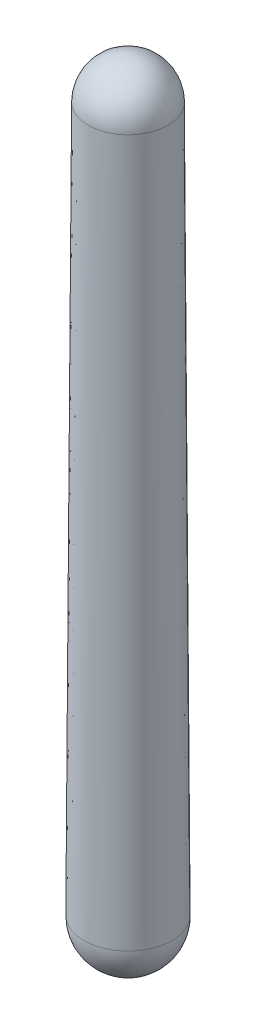
ISO-10303-21;
HEADER;
FILE_DESCRIPTION(('STEP AP214'),'2;1');
FILE_NAME('part.step','',(''),(''),'','','');
FILE_SCHEMA(('AUTOMOTIVE_DESIGN { 1 0 10303 214 1 1 1 1 }'));
ENDSEC;
DATA;
#1=APPLICATION_CONTEXT('core data for automotive mechanical design processes');
#2=APPLICATION_PROTOCOL_DEFINITION('international standard','automotive_design',2000,#1);
#3=PRODUCT_CONTEXT('',#1,'mechanical');
#4=PRODUCT('Part','Part','',(#3));
#5=PRODUCT_RELATED_PRODUCT_CATEGORY('part','',(#4));
#6=PRODUCT_DEFINITION_FORMATION('','',#4);
#7=PRODUCT_DEFINITION_CONTEXT('part definition',#1,'design');
#8=PRODUCT_DEFINITION('design','',#6,#7);
#9=PRODUCT_DEFINITION_SHAPE('','',#8);
#10=(LENGTH_UNIT() NAMED_UNIT(*) SI_UNIT(.MILLI.,.METRE.));
#11=(NAMED_UNIT(*) PLANE_ANGLE_UNIT() SI_UNIT($,.RADIAN.));
#12=(NAMED_UNIT(*) SI_UNIT($,.STERADIAN.) SOLID_ANGLE_UNIT());
#13=UNCERTAINTY_MEASURE_WITH_UNIT(LENGTH_MEASURE(1.E-05),#10,'distance_accuracy_value','');
#14=(GEOMETRIC_REPRESENTATION_CONTEXT(3) GLOBAL_UNCERTAINTY_ASSIGNED_CONTEXT((#13)) GLOBAL_UNIT_ASSIGNED_CONTEXT((#10,
#11,#12)) REPRESENTATION_CONTEXT('',''));
#15=CARTESIAN_POINT('',(0.,0.,0.));
#16=DIRECTION('',(0.,0.,1.));
#17=DIRECTION('',(1.,0.,0.));
#18=AXIS2_PLACEMENT_3D('',#15,#16,#17);
#19=CARTESIAN_POINT('',(0.,-120.,0.));
#20=DIRECTION('',(0.,-1.,0.));
#21=DIRECTION('',(0.,0.,-1.));
#22=AXIS2_PLACEMENT_3D('',#19,#20,#21);
#23=CONICAL_SURFACE('',#22,7.5,0.00583326716956072);
#24=CARTESIAN_POINT('',(0.,-119.912502978034,0.));
#25=DIRECTION('',(0.,-1.,0.));
#26=DIRECTION('',(0.,0.,-1.));
#27=AXIS2_PLACEMENT_3D('',#24,#25,#26);
#28=CIRCLE('',#27,7.4994896007052);
#29=CARTESIAN_POINT('',(0.,-119.912502978034,-7.4994896007052));
#30=VERTEX_POINT('',#29);
#31=EDGE_CURVE('E10',#30,#30,#28,.T.);
#32=ORIENTED_EDGE('',*,*,#31,.F.);
#33=EDGE_LOOP('',(#32));
#34=FACE_BOUND('',#33,.T.);
#35=CARTESIAN_POINT('',(0.,1.07311295266532E-09,0.));
#36=DIRECTION('',(0.,1.,0.));
#37=DIRECTION('',(0.,0.,1.));
#38=AXIS2_PLACEMENT_3D('',#35,#36,#37);
#39=CIRCLE('',#38,6.79999999999374);
#40=CARTESIAN_POINT('',(0.,1.07311295266532E-09,6.79999999999374));
#41=VERTEX_POINT('',#40);
#42=EDGE_CURVE('E34',#41,#41,#39,.T.);
#43=ORIENTED_EDGE('',*,*,#42,.F.);
#44=EDGE_LOOP('',(#43));
#45=FACE_BOUND('',#44,.T.);
#46=ADVANCED_FACE('F31',(#34,#45),#23,.T.);
#47=CARTESIAN_POINT('',(0.,0.,0.));
#48=DIRECTION('',(0.,-1.,0.));
#49=DIRECTION('',(1.,0.,0.));
#50=AXIS2_PLACEMENT_3D('',#47,#48,#49);
#51=SPHERICAL_SURFACE('',#50,6.8);
#52=ORIENTED_EDGE('',*,*,#42,.T.);
#53=EDGE_LOOP('',(#52));
#54=FACE_BOUND('',#53,.T.);
#55=ADVANCED_FACE('F43',(#54),#51,.T.);
#56=CARTESIAN_POINT('',(0.,-120.,0.));
#57=DIRECTION('',(0.,-1.,0.));
#58=DIRECTION('',(1.,0.,0.));
#59=AXIS2_PLACEMENT_3D('',#56,#57,#58);
#60=SPHERICAL_SURFACE('',#59,7.50000000000001);
#61=ORIENTED_EDGE('',*,*,#31,.T.);
#62=EDGE_LOOP('',(#61));
#63=FACE_BOUND('',#62,.T.);
#64=ADVANCED_FACE('F50',(#63),#60,.T.);
#65=CLOSED_SHELL('',(#46,#55,#64));
#66=MANIFOLD_SOLID_BREP('B2',#65);
#67=ADVANCED_BREP_SHAPE_REPRESENTATION('',(#18,#66),#14);
#68=SHAPE_DEFINITION_REPRESENTATION(#9,#67);
ENDSEC;
END-ISO-10303-21;
